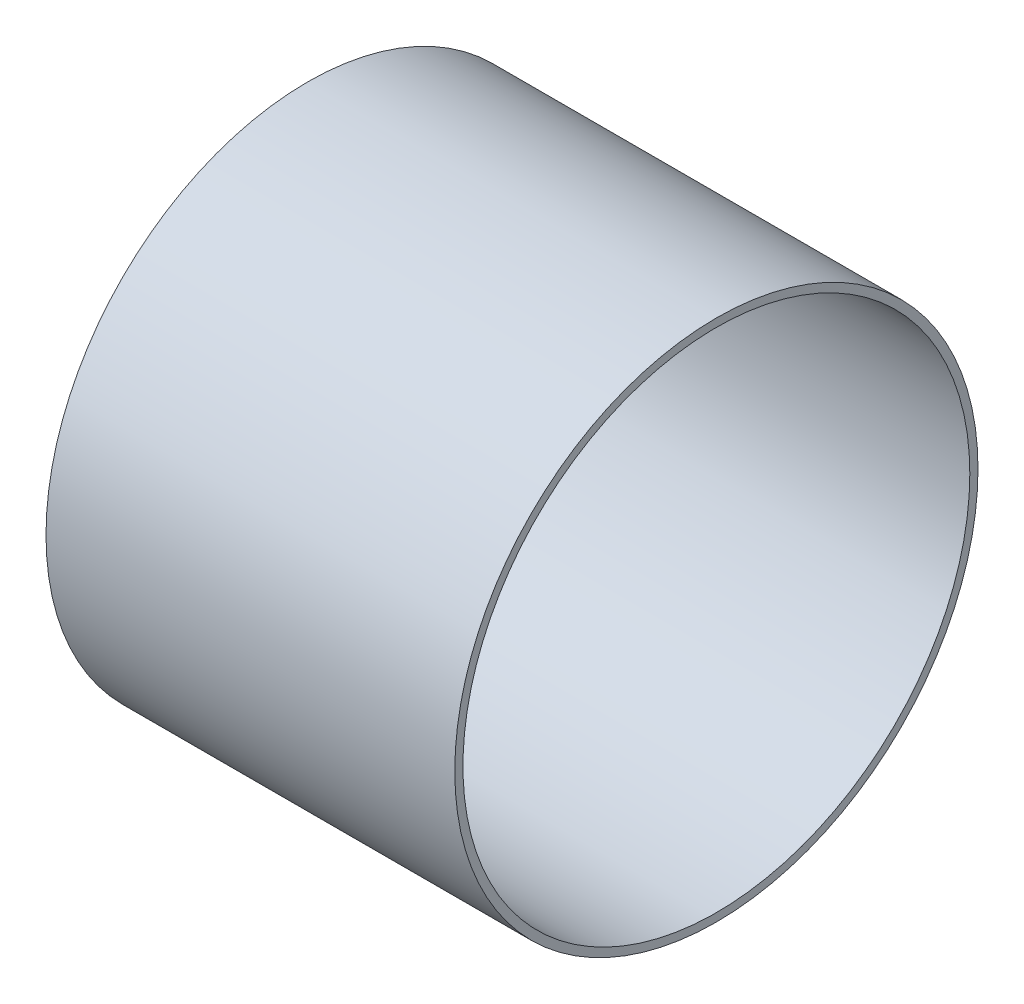
ISO-10303-21;
HEADER;
FILE_DESCRIPTION(('STEP AP214'),'2;1');
FILE_NAME('part.step','',(''),(''),'','','');
FILE_SCHEMA(('AUTOMOTIVE_DESIGN { 1 0 10303 214 1 1 1 1 }'));
ENDSEC;
DATA;
#1=APPLICATION_CONTEXT('core data for automotive mechanical design processes');
#2=APPLICATION_PROTOCOL_DEFINITION('international standard','automotive_design',2000,#1);
#3=PRODUCT_CONTEXT('',#1,'mechanical');
#4=PRODUCT('Part','Part','',(#3));
#5=PRODUCT_RELATED_PRODUCT_CATEGORY('part','',(#4));
#6=PRODUCT_DEFINITION_FORMATION('','',#4);
#7=PRODUCT_DEFINITION_CONTEXT('part definition',#1,'design');
#8=PRODUCT_DEFINITION('design','',#6,#7);
#9=PRODUCT_DEFINITION_SHAPE('','',#8);
#10=(LENGTH_UNIT() NAMED_UNIT(*) SI_UNIT(.MILLI.,.METRE.));
#11=(NAMED_UNIT(*) PLANE_ANGLE_UNIT() SI_UNIT($,.RADIAN.));
#12=(NAMED_UNIT(*) SI_UNIT($,.STERADIAN.) SOLID_ANGLE_UNIT());
#13=UNCERTAINTY_MEASURE_WITH_UNIT(LENGTH_MEASURE(1.E-05),#10,'distance_accuracy_value','');
#14=(GEOMETRIC_REPRESENTATION_CONTEXT(3) GLOBAL_UNCERTAINTY_ASSIGNED_CONTEXT((#13)) GLOBAL_UNIT_ASSIGNED_CONTEXT((#10,
#11,#12)) REPRESENTATION_CONTEXT('',''));
#15=CARTESIAN_POINT('',(0.,0.,0.));
#16=DIRECTION('',(0.,0.,1.));
#17=DIRECTION('',(1.,0.,0.));
#18=AXIS2_PLACEMENT_3D('',#15,#16,#17);
#19=CARTESIAN_POINT('',(50.8,0.,0.));
#20=DIRECTION('',(1.,0.,0.));
#21=DIRECTION('',(0.,0.,-1.));
#22=AXIS2_PLACEMENT_3D('',#19,#20,#21);
#23=PLANE('',#22);
#24=CARTESIAN_POINT('',(50.8,0.,0.));
#25=DIRECTION('',(1.,0.,0.));
#26=DIRECTION('',(0.,0.,-1.));
#27=AXIS2_PLACEMENT_3D('',#24,#25,#26);
#28=CIRCLE('',#27,32.512);
#29=CARTESIAN_POINT('',(50.8,0.,-32.512));
#30=VERTEX_POINT('',#29);
#31=EDGE_CURVE('E10',#30,#30,#28,.T.);
#32=ORIENTED_EDGE('',*,*,#31,.T.);
#33=EDGE_LOOP('',(#32));
#34=FACE_BOUND('',#33,.T.);
#35=CARTESIAN_POINT('',(50.8,0.,0.));
#36=DIRECTION('',(1.,0.,0.));
#37=DIRECTION('',(0.,0.,-1.));
#38=AXIS2_PLACEMENT_3D('',#35,#36,#37);
#39=CIRCLE('',#38,31.496);
#40=CARTESIAN_POINT('',(50.8,0.,-31.496));
#41=VERTEX_POINT('',#40);
#42=EDGE_CURVE('E50',#41,#41,#39,.T.);
#43=ORIENTED_EDGE('',*,*,#42,.F.);
#44=EDGE_LOOP('',(#43));
#45=FACE_BOUND('',#44,.T.);
#46=ADVANCED_FACE('F37',(#34,#45),#23,.T.);
#47=CARTESIAN_POINT('',(0.,0.,0.));
#48=DIRECTION('',(1.,0.,0.));
#49=DIRECTION('',(0.,0.,-1.));
#50=AXIS2_PLACEMENT_3D('',#47,#48,#49);
#51=PLANE('',#50);
#52=CARTESIAN_POINT('',(0.,0.,0.));
#53=DIRECTION('',(1.,0.,0.));
#54=DIRECTION('',(0.,0.,-1.));
#55=AXIS2_PLACEMENT_3D('',#52,#53,#54);
#56=CIRCLE('',#55,32.512);
#57=CARTESIAN_POINT('',(0.,0.,-32.512));
#58=VERTEX_POINT('',#57);
#59=EDGE_CURVE('E41',#58,#58,#56,.T.);
#60=ORIENTED_EDGE('',*,*,#59,.F.);
#61=EDGE_LOOP('',(#60));
#62=FACE_BOUND('',#61,.T.);
#63=CARTESIAN_POINT('',(0.,0.,0.));
#64=DIRECTION('',(1.,0.,0.));
#65=DIRECTION('',(0.,0.,-1.));
#66=AXIS2_PLACEMENT_3D('',#63,#64,#65);
#67=CIRCLE('',#66,31.496);
#68=CARTESIAN_POINT('',(0.,0.,-31.496));
#69=VERTEX_POINT('',#68);
#70=EDGE_CURVE('E52',#69,#69,#67,.T.);
#71=ORIENTED_EDGE('',*,*,#70,.T.);
#72=EDGE_LOOP('',(#71));
#73=FACE_BOUND('',#72,.T.);
#74=ADVANCED_FACE('F64',(#62,#73),#51,.F.);
#75=CARTESIAN_POINT('',(50.8,0.,0.));
#76=DIRECTION('',(-1.,0.,0.));
#77=DIRECTION('',(0.,0.,1.));
#78=AXIS2_PLACEMENT_3D('',#75,#76,#77);
#79=CYLINDRICAL_SURFACE('',#78,32.512);
#80=ORIENTED_EDGE('',*,*,#31,.F.);
#81=EDGE_LOOP('',(#80));
#82=FACE_BOUND('',#81,.T.);
#83=ORIENTED_EDGE('',*,*,#59,.T.);
#84=EDGE_LOOP('',(#83));
#85=FACE_BOUND('',#84,.T.);
#86=ADVANCED_FACE('F39',(#82,#85),#79,.T.);
#87=CARTESIAN_POINT('',(50.8,0.,0.));
#88=DIRECTION('',(-1.,0.,0.));
#89=DIRECTION('',(0.,0.,1.));
#90=AXIS2_PLACEMENT_3D('',#87,#88,#89);
#91=CYLINDRICAL_SURFACE('',#90,31.496);
#92=ORIENTED_EDGE('',*,*,#42,.T.);
#93=EDGE_LOOP('',(#92));
#94=FACE_BOUND('',#93,.T.);
#95=ORIENTED_EDGE('',*,*,#70,.F.);
#96=EDGE_LOOP('',(#95));
#97=FACE_BOUND('',#96,.T.);
#98=ADVANCED_FACE('F60',(#94,#97),#91,.F.);
#99=CLOSED_SHELL('',(#46,#74,#86,#98));
#100=MANIFOLD_SOLID_BREP('B2',#99);
#101=ADVANCED_BREP_SHAPE_REPRESENTATION('',(#18,#100),#14);
#102=SHAPE_DEFINITION_REPRESENTATION(#9,#101);
ENDSEC;
END-ISO-10303-21;
